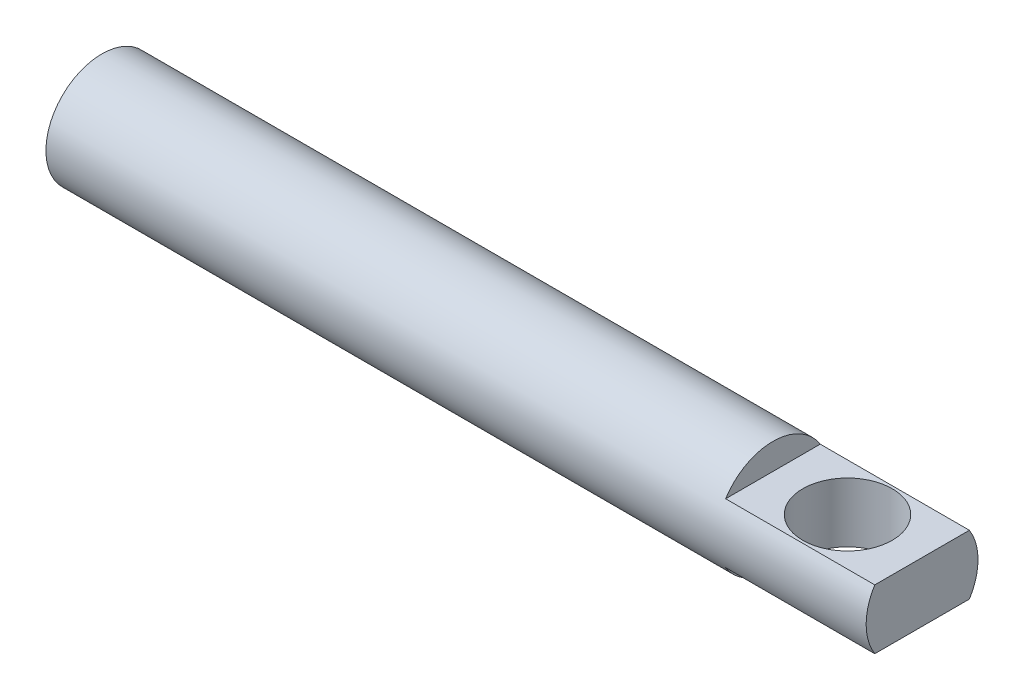
ISO-10303-21;
HEADER;
FILE_DESCRIPTION(('STEP AP214'),'2;1');
FILE_NAME('part.step','',(''),(''),'','','');
FILE_SCHEMA(('AUTOMOTIVE_DESIGN { 1 0 10303 214 1 1 1 1 }'));
ENDSEC;
DATA;
#1=APPLICATION_CONTEXT('core data for automotive mechanical design processes');
#2=APPLICATION_PROTOCOL_DEFINITION('international standard','automotive_design',2000,#1);
#3=PRODUCT_CONTEXT('',#1,'mechanical');
#4=PRODUCT('Part','Part','',(#3));
#5=PRODUCT_RELATED_PRODUCT_CATEGORY('part','',(#4));
#6=PRODUCT_DEFINITION_FORMATION('','',#4);
#7=PRODUCT_DEFINITION_CONTEXT('part definition',#1,'design');
#8=PRODUCT_DEFINITION('design','',#6,#7);
#9=PRODUCT_DEFINITION_SHAPE('','',#8);
#10=(LENGTH_UNIT() NAMED_UNIT(*) SI_UNIT(.MILLI.,.METRE.));
#11=(NAMED_UNIT(*) PLANE_ANGLE_UNIT() SI_UNIT($,.RADIAN.));
#12=(NAMED_UNIT(*) SI_UNIT($,.STERADIAN.) SOLID_ANGLE_UNIT());
#13=UNCERTAINTY_MEASURE_WITH_UNIT(LENGTH_MEASURE(1.E-05),#10,'distance_accuracy_value','');
#14=(GEOMETRIC_REPRESENTATION_CONTEXT(3) GLOBAL_UNCERTAINTY_ASSIGNED_CONTEXT((#13)) GLOBAL_UNIT_ASSIGNED_CONTEXT((#10,
#11,#12)) REPRESENTATION_CONTEXT('',''));
#15=CARTESIAN_POINT('',(0.,0.,0.));
#16=DIRECTION('',(0.,0.,1.));
#17=DIRECTION('',(1.,0.,0.));
#18=AXIS2_PLACEMENT_3D('',#15,#16,#17);
#19=CARTESIAN_POINT('',(45.,0.,0.));
#20=DIRECTION('',(1.,0.,0.));
#21=DIRECTION('',(0.,0.,-1.));
#22=AXIS2_PLACEMENT_3D('',#19,#20,#21);
#23=PLANE('',#22);
#24=DIRECTION('',(0.,0.,-1.));
#25=VECTOR('',#24,1.);
#26=CARTESIAN_POINT('',(45.,-2.,0.));
#27=LINE('',#26,#25);
#28=CARTESIAN_POINT('',(45.,-2.,3.17214438511238));
#29=VERTEX_POINT('',#28);
#30=CARTESIAN_POINT('',(45.,-2.,-3.17214438511238));
#31=VERTEX_POINT('',#30);
#32=EDGE_CURVE('E69',#29,#31,#27,.T.);
#33=ORIENTED_EDGE('',*,*,#32,.F.);
#34=CARTESIAN_POINT('',(45.,0.,0.));
#35=DIRECTION('',(1.,0.,0.));
#36=DIRECTION('',(0.,0.,-1.));
#37=AXIS2_PLACEMENT_3D('',#34,#35,#36);
#38=CIRCLE('',#37,3.75);
#39=EDGE_CURVE('E60',#29,#31,#38,.T.);
#40=ORIENTED_EDGE('',*,*,#39,.T.);
#41=EDGE_LOOP('',(#33,#40));
#42=FACE_BOUND('',#41,.T.);
#43=ADVANCED_FACE('F51',(#42),#23,.T.);
#44=CARTESIAN_POINT('',(45.,0.,0.));
#45=DIRECTION('',(-1.,0.,0.));
#46=DIRECTION('',(0.,0.,1.));
#47=AXIS2_PLACEMENT_3D('',#44,#45,#46);
#48=CYLINDRICAL_SURFACE('',#47,3.75);
#49=CARTESIAN_POINT('',(45.,2.,-3.17214438511238));
#50=VERTEX_POINT('',#49);
#51=CARTESIAN_POINT('',(45.,2.,3.17214438511238));
#52=VERTEX_POINT('',#51);
#53=EDGE_CURVE('E13',#50,#52,#38,.T.);
#54=ORIENTED_EDGE('',*,*,#53,.F.);
#55=DIRECTION('',(-1.,0.,0.));
#56=VECTOR('',#55,1.);
#57=CARTESIAN_POINT('',(55.,2.,-3.17214438511238));
#58=LINE('',#57,#56);
#59=CARTESIAN_POINT('',(55.,2.,-3.17214438511238));
#60=VERTEX_POINT('',#59);
#61=EDGE_CURVE('E94',#60,#50,#58,.T.);
#62=ORIENTED_EDGE('',*,*,#61,.F.);
#63=CARTESIAN_POINT('',(55.,0.,0.));
#64=DIRECTION('',(1.,0.,0.));
#65=DIRECTION('',(0.,0.,-1.));
#66=AXIS2_PLACEMENT_3D('',#63,#64,#65);
#67=CIRCLE('',#66,3.75);
#68=CARTESIAN_POINT('',(55.,-2.,-3.17214438511238));
#69=VERTEX_POINT('',#68);
#70=EDGE_CURVE('E100',#69,#60,#67,.T.);
#71=ORIENTED_EDGE('',*,*,#70,.F.);
#72=DIRECTION('',(-1.,0.,0.));
#73=VECTOR('',#72,1.);
#74=CARTESIAN_POINT('',(55.,-2.,-3.17214438511238));
#75=LINE('',#74,#73);
#76=EDGE_CURVE('E120',#69,#31,#75,.T.);
#77=ORIENTED_EDGE('',*,*,#76,.T.);
#78=ORIENTED_EDGE('',*,*,#39,.F.);
#79=DIRECTION('',(-1.,0.,0.));
#80=VECTOR('',#79,1.);
#81=CARTESIAN_POINT('',(55.,-2.,3.17214438511238));
#82=LINE('',#81,#80);
#83=CARTESIAN_POINT('',(55.,-2.,3.17214438511238));
#84=VERTEX_POINT('',#83);
#85=EDGE_CURVE('E115',#84,#29,#82,.T.);
#86=ORIENTED_EDGE('',*,*,#85,.F.);
#87=CARTESIAN_POINT('',(55.,2.,3.17214438511238));
#88=VERTEX_POINT('',#87);
#89=EDGE_CURVE('E99',#88,#84,#67,.T.);
#90=ORIENTED_EDGE('',*,*,#89,.F.);
#91=DIRECTION('',(-1.,0.,0.));
#92=VECTOR('',#91,1.);
#93=CARTESIAN_POINT('',(55.,2.,3.17214438511238));
#94=LINE('',#93,#92);
#95=EDGE_CURVE('E96',#88,#52,#94,.T.);
#96=ORIENTED_EDGE('',*,*,#95,.T.);
#97=EDGE_LOOP('',(#54,#62,#71,#77,#78,#86,#90,#96));
#98=FACE_BOUND('',#97,.T.);
#99=CARTESIAN_POINT('',(0.,0.,0.));
#100=DIRECTION('',(1.,0.,0.));
#101=DIRECTION('',(0.,0.,-1.));
#102=AXIS2_PLACEMENT_3D('',#99,#100,#101);
#103=CIRCLE('',#102,3.75);
#104=CARTESIAN_POINT('',(0.,0.,-3.75));
#105=VERTEX_POINT('',#104);
#106=EDGE_CURVE('E112',#105,#105,#103,.T.);
#107=ORIENTED_EDGE('',*,*,#106,.T.);
#108=EDGE_LOOP('',(#107));
#109=FACE_BOUND('',#108,.T.);
#110=ADVANCED_FACE('F53',(#98,#109),#48,.T.);
#111=DIRECTION('',(0.,0.,1.));
#112=VECTOR('',#111,1.);
#113=CARTESIAN_POINT('',(45.,2.,0.));
#114=LINE('',#113,#112);
#115=EDGE_CURVE('E123',#50,#52,#114,.T.);
#116=ORIENTED_EDGE('',*,*,#115,.F.);
#117=ORIENTED_EDGE('',*,*,#53,.T.);
#118=EDGE_LOOP('',(#116,#117));
#119=FACE_BOUND('',#118,.T.);
#120=ADVANCED_FACE('F145',(#119),#23,.T.);
#121=CARTESIAN_POINT('',(0.,0.,0.));
#122=DIRECTION('',(1.,0.,0.));
#123=DIRECTION('',(0.,0.,-1.));
#124=AXIS2_PLACEMENT_3D('',#121,#122,#123);
#125=PLANE('',#124);
#126=ORIENTED_EDGE('',*,*,#106,.F.);
#127=EDGE_LOOP('',(#126));
#128=FACE_BOUND('',#127,.T.);
#129=ADVANCED_FACE('F153',(#128),#125,.F.);
#130=CARTESIAN_POINT('',(55.,2.,0.));
#131=DIRECTION('',(0.,-1.,0.));
#132=DIRECTION('',(0.,0.,-1.));
#133=AXIS2_PLACEMENT_3D('',#130,#131,#132);
#134=PLANE('',#133);
#135=CARTESIAN_POINT('',(50.,2.,0.));
#136=DIRECTION('',(0.,1.,0.));
#137=DIRECTION('',(0.,0.,1.));
#138=AXIS2_PLACEMENT_3D('',#135,#136,#137);
#139=CIRCLE('',#138,3.);
#140=CARTESIAN_POINT('',(50.,2.,3.));
#141=VERTEX_POINT('',#140);
#142=EDGE_CURVE('E126',#141,#141,#139,.T.);
#143=ORIENTED_EDGE('',*,*,#142,.F.);
#144=EDGE_LOOP('',(#143));
#145=FACE_BOUND('',#144,.T.);
#146=ORIENTED_EDGE('',*,*,#115,.T.);
#147=ORIENTED_EDGE('',*,*,#95,.F.);
#148=DIRECTION('',(0.,0.,1.));
#149=VECTOR('',#148,1.);
#150=CARTESIAN_POINT('',(55.,2.,0.));
#151=LINE('',#150,#149);
#152=EDGE_CURVE('E89',#60,#88,#151,.T.);
#153=ORIENTED_EDGE('',*,*,#152,.F.);
#154=ORIENTED_EDGE('',*,*,#61,.T.);
#155=EDGE_LOOP('',(#146,#147,#153,#154));
#156=FACE_BOUND('',#155,.T.);
#157=ADVANCED_FACE('F92',(#145,#156),#134,.F.);
#158=CARTESIAN_POINT('',(55.,-2.,0.));
#159=DIRECTION('',(0.,1.,0.));
#160=DIRECTION('',(0.,0.,1.));
#161=AXIS2_PLACEMENT_3D('',#158,#159,#160);
#162=PLANE('',#161);
#163=CARTESIAN_POINT('',(50.,-2.,0.));
#164=DIRECTION('',(0.,1.,0.));
#165=DIRECTION('',(0.,0.,1.));
#166=AXIS2_PLACEMENT_3D('',#163,#164,#165);
#167=CIRCLE('',#166,3.);
#168=CARTESIAN_POINT('',(50.,-2.,3.));
#169=VERTEX_POINT('',#168);
#170=EDGE_CURVE('E55',#169,#169,#167,.T.);
#171=ORIENTED_EDGE('',*,*,#170,.T.);
#172=EDGE_LOOP('',(#171));
#173=FACE_BOUND('',#172,.T.);
#174=ORIENTED_EDGE('',*,*,#32,.T.);
#175=ORIENTED_EDGE('',*,*,#76,.F.);
#176=DIRECTION('',(0.,0.,-1.));
#177=VECTOR('',#176,1.);
#178=CARTESIAN_POINT('',(55.,-2.,0.));
#179=LINE('',#178,#177);
#180=EDGE_CURVE('E105',#84,#69,#179,.T.);
#181=ORIENTED_EDGE('',*,*,#180,.F.);
#182=ORIENTED_EDGE('',*,*,#85,.T.);
#183=EDGE_LOOP('',(#174,#175,#181,#182));
#184=FACE_BOUND('',#183,.T.);
#185=ADVANCED_FACE('F133',(#173,#184),#162,.F.);
#186=CARTESIAN_POINT('',(55.,0.,0.));
#187=DIRECTION('',(1.,0.,0.));
#188=DIRECTION('',(0.,0.,-1.));
#189=AXIS2_PLACEMENT_3D('',#186,#187,#188);
#190=PLANE('',#189);
#191=ORIENTED_EDGE('',*,*,#70,.T.);
#192=ORIENTED_EDGE('',*,*,#152,.T.);
#193=ORIENTED_EDGE('',*,*,#89,.T.);
#194=ORIENTED_EDGE('',*,*,#180,.T.);
#195=EDGE_LOOP('',(#191,#192,#193,#194));
#196=FACE_BOUND('',#195,.T.);
#197=ADVANCED_FACE('F103',(#196),#190,.T.);
#198=CARTESIAN_POINT('',(50.,-8.,0.));
#199=DIRECTION('',(0.,1.,0.));
#200=DIRECTION('',(0.,0.,1.));
#201=AXIS2_PLACEMENT_3D('',#198,#199,#200);
#202=CYLINDRICAL_SURFACE('',#201,3.);
#203=ORIENTED_EDGE('',*,*,#142,.T.);
#204=EDGE_LOOP('',(#203));
#205=FACE_BOUND('',#204,.T.);
#206=ORIENTED_EDGE('',*,*,#170,.F.);
#207=EDGE_LOOP('',(#206));
#208=FACE_BOUND('',#207,.T.);
#209=ADVANCED_FACE('F136',(#205,#208),#202,.F.);
#210=CLOSED_SHELL('',(#43,#110,#120,#129,#157,#185,#197,#209));
#211=MANIFOLD_SOLID_BREP('B2',#210);
#212=ADVANCED_BREP_SHAPE_REPRESENTATION('',(#18,#211),#14);
#213=SHAPE_DEFINITION_REPRESENTATION(#9,#212);
ENDSEC;
END-ISO-10303-21;
